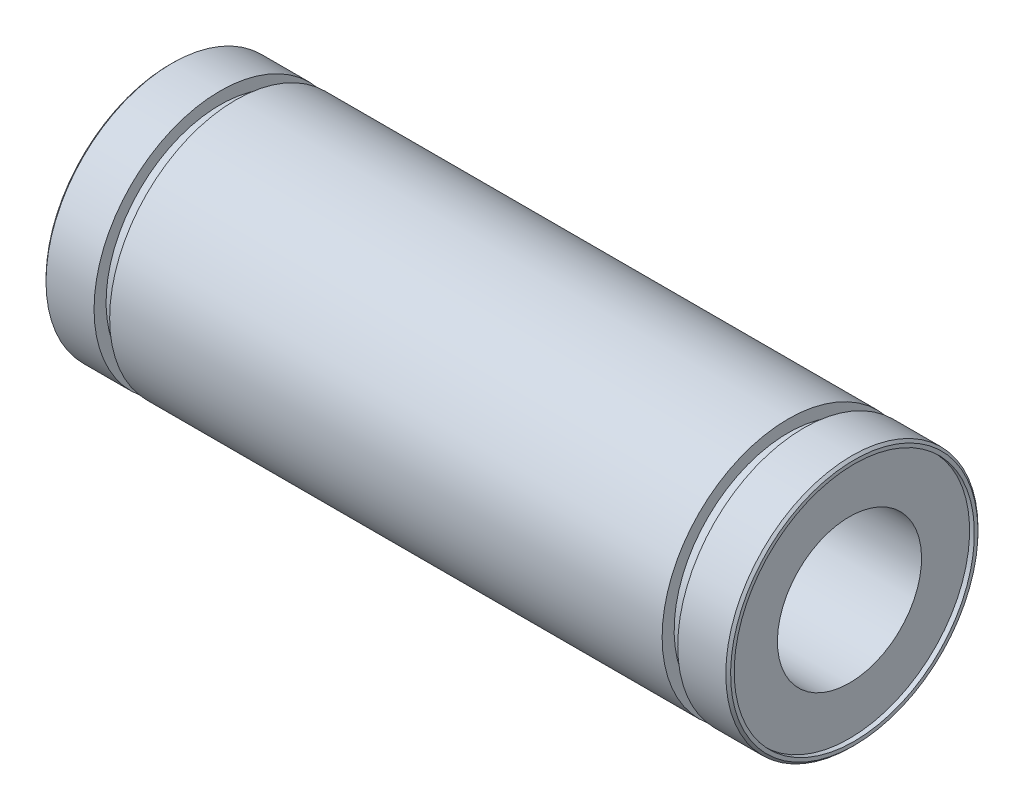
ISO-10303-21;
HEADER;
FILE_DESCRIPTION(('STEP AP214'),'2;1');
FILE_NAME('part.step','',(''),(''),'','','');
FILE_SCHEMA(('AUTOMOTIVE_DESIGN { 1 0 10303 214 1 1 1 1 }'));
ENDSEC;
DATA;
#1=APPLICATION_CONTEXT('core data for automotive mechanical design processes');
#2=APPLICATION_PROTOCOL_DEFINITION('international standard','automotive_design',2000,#1);
#3=PRODUCT_CONTEXT('',#1,'mechanical');
#4=PRODUCT('Part','Part','',(#3));
#5=PRODUCT_RELATED_PRODUCT_CATEGORY('part','',(#4));
#6=PRODUCT_DEFINITION_FORMATION('','',#4);
#7=PRODUCT_DEFINITION_CONTEXT('part definition',#1,'design');
#8=PRODUCT_DEFINITION('design','',#6,#7);
#9=PRODUCT_DEFINITION_SHAPE('','',#8);
#10=(LENGTH_UNIT() NAMED_UNIT(*) SI_UNIT(.MILLI.,.METRE.));
#11=(NAMED_UNIT(*) PLANE_ANGLE_UNIT() SI_UNIT($,.RADIAN.));
#12=(NAMED_UNIT(*) SI_UNIT($,.STERADIAN.) SOLID_ANGLE_UNIT());
#13=UNCERTAINTY_MEASURE_WITH_UNIT(LENGTH_MEASURE(1.E-05),#10,'distance_accuracy_value','');
#14=(GEOMETRIC_REPRESENTATION_CONTEXT(3) GLOBAL_UNCERTAINTY_ASSIGNED_CONTEXT((#13)) GLOBAL_UNIT_ASSIGNED_CONTEXT((#10,
#11,#12)) REPRESENTATION_CONTEXT('',''));
#15=CARTESIAN_POINT('',(0.,0.,0.));
#16=DIRECTION('',(0.,0.,1.));
#17=DIRECTION('',(1.,0.,0.));
#18=AXIS2_PLACEMENT_3D('',#15,#16,#17);
#19=CARTESIAN_POINT('',(-28.5,0.,0.));
#20=DIRECTION('',(-1.,0.,0.));
#21=DIRECTION('',(0.,-1.,0.));
#22=AXIS2_PLACEMENT_3D('',#19,#20,#21);
#23=PLANE('',#22);
#24=CARTESIAN_POINT('',(-28.5,0.,0.));
#25=DIRECTION('',(-1.,0.,0.));
#26=DIRECTION('',(0.,-1.,0.));
#27=AXIS2_PLACEMENT_3D('',#24,#25,#26);
#28=CIRCLE('',#27,10.3);
#29=CARTESIAN_POINT('',(-28.5,-10.3,0.));
#30=VERTEX_POINT('',#29);
#31=EDGE_CURVE('E102',#30,#30,#28,.T.);
#32=ORIENTED_EDGE('',*,*,#31,.T.);
#33=EDGE_LOOP('',(#32));
#34=FACE_BOUND('',#33,.T.);
#35=CARTESIAN_POINT('',(-28.5,0.,0.));
#36=DIRECTION('',(-1.,0.,0.));
#37=DIRECTION('',(0.,-1.,0.));
#38=AXIS2_PLACEMENT_3D('',#35,#36,#37);
#39=CIRCLE('',#38,10.);
#40=CARTESIAN_POINT('',(-28.5,-10.,0.));
#41=VERTEX_POINT('',#40);
#42=EDGE_CURVE('E12',#41,#41,#39,.T.);
#43=ORIENTED_EDGE('',*,*,#42,.F.);
#44=EDGE_LOOP('',(#43));
#45=FACE_BOUND('',#44,.T.);
#46=ADVANCED_FACE('F44',(#34,#45),#23,.T.);
#47=CARTESIAN_POINT('',(-28.5,0.,0.));
#48=DIRECTION('',(-1.,0.,0.));
#49=DIRECTION('',(0.,-1.,0.));
#50=AXIS2_PLACEMENT_3D('',#47,#48,#49);
#51=CYLINDRICAL_SURFACE('',#50,10.);
#52=ORIENTED_EDGE('',*,*,#42,.T.);
#53=EDGE_LOOP('',(#52));
#54=FACE_BOUND('',#53,.T.);
#55=CARTESIAN_POINT('',(-28.1,0.,0.));
#56=DIRECTION('',(-1.,0.,0.));
#57=DIRECTION('',(0.,-1.,0.));
#58=AXIS2_PLACEMENT_3D('',#55,#56,#57);
#59=CIRCLE('',#58,10.);
#60=CARTESIAN_POINT('',(-28.1,-10.,0.));
#61=VERTEX_POINT('',#60);
#62=EDGE_CURVE('E50',#61,#61,#59,.T.);
#63=ORIENTED_EDGE('',*,*,#62,.F.);
#64=EDGE_LOOP('',(#63));
#65=FACE_BOUND('',#64,.T.);
#66=ADVANCED_FACE('F120',(#54,#65),#51,.F.);
#67=CARTESIAN_POINT('',(-28.1,0.,0.));
#68=DIRECTION('',(-1.,0.,0.));
#69=DIRECTION('',(0.,-1.,0.));
#70=AXIS2_PLACEMENT_3D('',#67,#68,#69);
#71=PLANE('',#70);
#72=ORIENTED_EDGE('',*,*,#62,.T.);
#73=EDGE_LOOP('',(#72));
#74=FACE_BOUND('',#73,.T.);
#75=CARTESIAN_POINT('',(-28.1,0.,0.));
#76=DIRECTION('',(-1.,0.,0.));
#77=DIRECTION('',(0.,-1.,0.));
#78=AXIS2_PLACEMENT_3D('',#75,#76,#77);
#79=CIRCLE('',#78,6.);
#80=CARTESIAN_POINT('',(-28.1,-6.00000000000001,0.));
#81=VERTEX_POINT('',#80);
#82=EDGE_CURVE('E54',#81,#81,#79,.T.);
#83=ORIENTED_EDGE('',*,*,#82,.F.);
#84=EDGE_LOOP('',(#83));
#85=FACE_BOUND('',#84,.T.);
#86=ADVANCED_FACE('F124',(#74,#85),#71,.T.);
#87=CARTESIAN_POINT('',(-28.5,0.,0.));
#88=DIRECTION('',(-1.,0.,0.));
#89=DIRECTION('',(0.,-1.,0.));
#90=AXIS2_PLACEMENT_3D('',#87,#88,#89);
#91=CYLINDRICAL_SURFACE('',#90,6.);
#92=CARTESIAN_POINT('',(28.1,0.,0.));
#93=DIRECTION('',(-1.,0.,0.));
#94=DIRECTION('',(0.,-1.,0.));
#95=AXIS2_PLACEMENT_3D('',#92,#93,#94);
#96=CIRCLE('',#95,6.);
#97=CARTESIAN_POINT('',(28.1,-6.,0.));
#98=VERTEX_POINT('',#97);
#99=EDGE_CURVE('E58',#98,#98,#96,.T.);
#100=ORIENTED_EDGE('',*,*,#99,.F.);
#101=EDGE_LOOP('',(#100));
#102=FACE_BOUND('',#101,.T.);
#103=ORIENTED_EDGE('',*,*,#82,.T.);
#104=EDGE_LOOP('',(#103));
#105=FACE_BOUND('',#104,.T.);
#106=ADVANCED_FACE('F128',(#102,#105),#91,.F.);
#107=CARTESIAN_POINT('',(28.1,0.,0.));
#108=DIRECTION('',(-1.,0.,0.));
#109=DIRECTION('',(0.,-1.,0.));
#110=AXIS2_PLACEMENT_3D('',#107,#108,#109);
#111=PLANE('',#110);
#112=CARTESIAN_POINT('',(28.1,0.,0.));
#113=DIRECTION('',(-1.,0.,0.));
#114=DIRECTION('',(0.,-1.,0.));
#115=AXIS2_PLACEMENT_3D('',#112,#113,#114);
#116=CIRCLE('',#115,10.);
#117=CARTESIAN_POINT('',(28.1,-10.,0.));
#118=VERTEX_POINT('',#117);
#119=EDGE_CURVE('E63',#118,#118,#116,.T.);
#120=ORIENTED_EDGE('',*,*,#119,.F.);
#121=EDGE_LOOP('',(#120));
#122=FACE_BOUND('',#121,.T.);
#123=ORIENTED_EDGE('',*,*,#99,.T.);
#124=EDGE_LOOP('',(#123));
#125=FACE_BOUND('',#124,.T.);
#126=ADVANCED_FACE('F134',(#122,#125),#111,.F.);
#127=CARTESIAN_POINT('',(-28.5,0.,0.));
#128=DIRECTION('',(-1.,0.,0.));
#129=DIRECTION('',(0.,-1.,0.));
#130=AXIS2_PLACEMENT_3D('',#127,#128,#129);
#131=CYLINDRICAL_SURFACE('',#130,10.);
#132=CARTESIAN_POINT('',(28.5,0.,0.));
#133=DIRECTION('',(-1.,0.,0.));
#134=DIRECTION('',(0.,-1.,0.));
#135=AXIS2_PLACEMENT_3D('',#132,#133,#134);
#136=CIRCLE('',#135,10.);
#137=CARTESIAN_POINT('',(28.5,-10.,0.));
#138=VERTEX_POINT('',#137);
#139=EDGE_CURVE('E66',#138,#138,#136,.T.);
#140=ORIENTED_EDGE('',*,*,#139,.F.);
#141=EDGE_LOOP('',(#140));
#142=FACE_BOUND('',#141,.T.);
#143=ORIENTED_EDGE('',*,*,#119,.T.);
#144=EDGE_LOOP('',(#143));
#145=FACE_BOUND('',#144,.T.);
#146=ADVANCED_FACE('F138',(#142,#145),#131,.F.);
#147=CARTESIAN_POINT('',(28.5,0.,0.));
#148=DIRECTION('',(-1.,0.,0.));
#149=DIRECTION('',(0.,-1.,0.));
#150=AXIS2_PLACEMENT_3D('',#147,#148,#149);
#151=PLANE('',#150);
#152=CARTESIAN_POINT('',(28.5,0.,0.));
#153=DIRECTION('',(-1.,0.,0.));
#154=DIRECTION('',(0.,-1.,0.));
#155=AXIS2_PLACEMENT_3D('',#152,#153,#154);
#156=CIRCLE('',#155,10.3);
#157=CARTESIAN_POINT('',(28.5,-10.3,0.));
#158=VERTEX_POINT('',#157);
#159=EDGE_CURVE('E69',#158,#158,#156,.T.);
#160=ORIENTED_EDGE('',*,*,#159,.F.);
#161=EDGE_LOOP('',(#160));
#162=FACE_BOUND('',#161,.T.);
#163=ORIENTED_EDGE('',*,*,#139,.T.);
#164=EDGE_LOOP('',(#163));
#165=FACE_BOUND('',#164,.T.);
#166=ADVANCED_FACE('F142',(#162,#165),#151,.F.);
#167=CARTESIAN_POINT('',(28.5,0.,0.));
#168=DIRECTION('',(-1.,0.,0.));
#169=DIRECTION('',(0.,-1.,0.));
#170=AXIS2_PLACEMENT_3D('',#167,#168,#169);
#171=CONICAL_SURFACE('',#170,10.3,0.785398163397457);
#172=CARTESIAN_POINT('',(28.3,0.,0.));
#173=DIRECTION('',(-1.,0.,0.));
#174=DIRECTION('',(0.,-1.,0.));
#175=AXIS2_PLACEMENT_3D('',#172,#173,#174);
#176=CIRCLE('',#175,10.5);
#177=CARTESIAN_POINT('',(28.3,-10.5,0.));
#178=VERTEX_POINT('',#177);
#179=EDGE_CURVE('E72',#178,#178,#176,.T.);
#180=ORIENTED_EDGE('',*,*,#179,.F.);
#181=EDGE_LOOP('',(#180));
#182=FACE_BOUND('',#181,.T.);
#183=ORIENTED_EDGE('',*,*,#159,.T.);
#184=EDGE_LOOP('',(#183));
#185=FACE_BOUND('',#184,.T.);
#186=ADVANCED_FACE('F146',(#182,#185),#171,.T.);
#187=CARTESIAN_POINT('',(-28.5,0.,0.));
#188=DIRECTION('',(-1.,0.,0.));
#189=DIRECTION('',(0.,-1.,0.));
#190=AXIS2_PLACEMENT_3D('',#187,#188,#189);
#191=CYLINDRICAL_SURFACE('',#190,10.5);
#192=CARTESIAN_POINT('',(24.3,0.,0.));
#193=DIRECTION('',(-1.,0.,0.));
#194=DIRECTION('',(0.,-1.,0.));
#195=AXIS2_PLACEMENT_3D('',#192,#193,#194);
#196=CIRCLE('',#195,10.4999999999999);
#197=CARTESIAN_POINT('',(24.3,-10.4999999999999,0.));
#198=VERTEX_POINT('',#197);
#199=EDGE_CURVE('E75',#198,#198,#196,.T.);
#200=ORIENTED_EDGE('',*,*,#199,.F.);
#201=EDGE_LOOP('',(#200));
#202=FACE_BOUND('',#201,.T.);
#203=ORIENTED_EDGE('',*,*,#179,.T.);
#204=EDGE_LOOP('',(#203));
#205=FACE_BOUND('',#204,.T.);
#206=ADVANCED_FACE('F150',(#202,#205),#191,.T.);
#207=CARTESIAN_POINT('',(24.3,0.,0.));
#208=DIRECTION('',(1.,0.,0.));
#209=DIRECTION('',(0.,1.,0.));
#210=AXIS2_PLACEMENT_3D('',#207,#208,#209);
#211=PLANE('',#210);
#212=CARTESIAN_POINT('',(24.3,0.,0.));
#213=DIRECTION('',(-1.,0.,0.));
#214=DIRECTION('',(0.,-1.,0.));
#215=AXIS2_PLACEMENT_3D('',#212,#213,#214);
#216=CIRCLE('',#215,9.50000000000001);
#217=CARTESIAN_POINT('',(24.3,-9.50000000000001,0.));
#218=VERTEX_POINT('',#217);
#219=EDGE_CURVE('E78',#218,#218,#216,.T.);
#220=ORIENTED_EDGE('',*,*,#219,.F.);
#221=EDGE_LOOP('',(#220));
#222=FACE_BOUND('',#221,.T.);
#223=ORIENTED_EDGE('',*,*,#199,.T.);
#224=EDGE_LOOP('',(#223));
#225=FACE_BOUND('',#224,.T.);
#226=ADVANCED_FACE('F154',(#222,#225),#211,.F.);
#227=CARTESIAN_POINT('',(-28.5,0.,0.));
#228=DIRECTION('',(-1.,0.,0.));
#229=DIRECTION('',(0.,-1.,0.));
#230=AXIS2_PLACEMENT_3D('',#227,#228,#229);
#231=CYLINDRICAL_SURFACE('',#230,9.50000000000001);
#232=CARTESIAN_POINT('',(23.,0.,0.));
#233=DIRECTION('',(-1.,0.,0.));
#234=DIRECTION('',(0.,-1.,0.));
#235=AXIS2_PLACEMENT_3D('',#232,#233,#234);
#236=CIRCLE('',#235,9.50000000000001);
#237=CARTESIAN_POINT('',(23.,-9.50000000000001,0.));
#238=VERTEX_POINT('',#237);
#239=EDGE_CURVE('E81',#238,#238,#236,.T.);
#240=ORIENTED_EDGE('',*,*,#239,.F.);
#241=EDGE_LOOP('',(#240));
#242=FACE_BOUND('',#241,.T.);
#243=ORIENTED_EDGE('',*,*,#219,.T.);
#244=EDGE_LOOP('',(#243));
#245=FACE_BOUND('',#244,.T.);
#246=ADVANCED_FACE('F158',(#242,#245),#231,.T.);
#247=CARTESIAN_POINT('',(23.,0.,0.));
#248=DIRECTION('',(-1.,0.,0.));
#249=DIRECTION('',(0.,-1.,0.));
#250=AXIS2_PLACEMENT_3D('',#247,#248,#249);
#251=PLANE('',#250);
#252=CARTESIAN_POINT('',(23.,0.,0.));
#253=DIRECTION('',(-1.,0.,0.));
#254=DIRECTION('',(0.,-1.,0.));
#255=AXIS2_PLACEMENT_3D('',#252,#253,#254);
#256=CIRCLE('',#255,10.4999999999999);
#257=CARTESIAN_POINT('',(23.,-10.4999999999999,0.));
#258=VERTEX_POINT('',#257);
#259=EDGE_CURVE('E84',#258,#258,#256,.T.);
#260=ORIENTED_EDGE('',*,*,#259,.F.);
#261=EDGE_LOOP('',(#260));
#262=FACE_BOUND('',#261,.T.);
#263=ORIENTED_EDGE('',*,*,#239,.T.);
#264=EDGE_LOOP('',(#263));
#265=FACE_BOUND('',#264,.T.);
#266=ADVANCED_FACE('F162',(#262,#265),#251,.F.);
#267=CARTESIAN_POINT('',(-28.5,0.,0.));
#268=DIRECTION('',(-1.,0.,0.));
#269=DIRECTION('',(0.,-1.,0.));
#270=AXIS2_PLACEMENT_3D('',#267,#268,#269);
#271=CYLINDRICAL_SURFACE('',#270,10.4999999999999);
#272=CARTESIAN_POINT('',(-23.,0.,0.));
#273=DIRECTION('',(-1.,0.,0.));
#274=DIRECTION('',(0.,-1.,0.));
#275=AXIS2_PLACEMENT_3D('',#272,#273,#274);
#276=CIRCLE('',#275,10.4999999999999);
#277=CARTESIAN_POINT('',(-23.,-10.5,0.));
#278=VERTEX_POINT('',#277);
#279=EDGE_CURVE('E87',#278,#278,#276,.T.);
#280=ORIENTED_EDGE('',*,*,#279,.F.);
#281=EDGE_LOOP('',(#280));
#282=FACE_BOUND('',#281,.T.);
#283=ORIENTED_EDGE('',*,*,#259,.T.);
#284=EDGE_LOOP('',(#283));
#285=FACE_BOUND('',#284,.T.);
#286=ADVANCED_FACE('F166',(#282,#285),#271,.T.);
#287=CARTESIAN_POINT('',(-23.,0.,0.));
#288=DIRECTION('',(-1.,0.,0.));
#289=DIRECTION('',(0.,-1.,0.));
#290=AXIS2_PLACEMENT_3D('',#287,#288,#289);
#291=PLANE('',#290);
#292=ORIENTED_EDGE('',*,*,#279,.T.);
#293=EDGE_LOOP('',(#292));
#294=FACE_BOUND('',#293,.T.);
#295=CARTESIAN_POINT('',(-23.,0.,0.));
#296=DIRECTION('',(-1.,0.,0.));
#297=DIRECTION('',(0.,-1.,0.));
#298=AXIS2_PLACEMENT_3D('',#295,#296,#297);
#299=CIRCLE('',#298,9.50000000000001);
#300=CARTESIAN_POINT('',(-23.,-9.50000000000001,0.));
#301=VERTEX_POINT('',#300);
#302=EDGE_CURVE('E90',#301,#301,#299,.T.);
#303=ORIENTED_EDGE('',*,*,#302,.F.);
#304=EDGE_LOOP('',(#303));
#305=FACE_BOUND('',#304,.T.);
#306=ADVANCED_FACE('F170',(#294,#305),#291,.T.);
#307=CARTESIAN_POINT('',(-28.5,0.,0.));
#308=DIRECTION('',(-1.,0.,0.));
#309=DIRECTION('',(0.,-1.,0.));
#310=AXIS2_PLACEMENT_3D('',#307,#308,#309);
#311=CYLINDRICAL_SURFACE('',#310,9.50000000000001);
#312=ORIENTED_EDGE('',*,*,#302,.T.);
#313=EDGE_LOOP('',(#312));
#314=FACE_BOUND('',#313,.T.);
#315=CARTESIAN_POINT('',(-24.3,0.,0.));
#316=DIRECTION('',(-1.,0.,0.));
#317=DIRECTION('',(0.,-1.,0.));
#318=AXIS2_PLACEMENT_3D('',#315,#316,#317);
#319=CIRCLE('',#318,9.50000000000001);
#320=CARTESIAN_POINT('',(-24.3,-9.50000000000001,0.));
#321=VERTEX_POINT('',#320);
#322=EDGE_CURVE('E93',#321,#321,#319,.T.);
#323=ORIENTED_EDGE('',*,*,#322,.F.);
#324=EDGE_LOOP('',(#323));
#325=FACE_BOUND('',#324,.T.);
#326=ADVANCED_FACE('F174',(#314,#325),#311,.T.);
#327=CARTESIAN_POINT('',(-24.3,0.,0.));
#328=DIRECTION('',(1.,0.,0.));
#329=DIRECTION('',(0.,1.,0.));
#330=AXIS2_PLACEMENT_3D('',#327,#328,#329);
#331=PLANE('',#330);
#332=ORIENTED_EDGE('',*,*,#322,.T.);
#333=EDGE_LOOP('',(#332));
#334=FACE_BOUND('',#333,.T.);
#335=CARTESIAN_POINT('',(-24.3,0.,0.));
#336=DIRECTION('',(-1.,0.,0.));
#337=DIRECTION('',(0.,-1.,0.));
#338=AXIS2_PLACEMENT_3D('',#335,#336,#337);
#339=CIRCLE('',#338,10.4999999999999);
#340=CARTESIAN_POINT('',(-24.3,-10.5,0.));
#341=VERTEX_POINT('',#340);
#342=EDGE_CURVE('E96',#341,#341,#339,.T.);
#343=ORIENTED_EDGE('',*,*,#342,.F.);
#344=EDGE_LOOP('',(#343));
#345=FACE_BOUND('',#344,.T.);
#346=ADVANCED_FACE('F116',(#334,#345),#331,.T.);
#347=CARTESIAN_POINT('',(-28.5,0.,0.));
#348=DIRECTION('',(-1.,0.,0.));
#349=DIRECTION('',(0.,-1.,0.));
#350=AXIS2_PLACEMENT_3D('',#347,#348,#349);
#351=CYLINDRICAL_SURFACE('',#350,10.5);
#352=ORIENTED_EDGE('',*,*,#342,.T.);
#353=EDGE_LOOP('',(#352));
#354=FACE_BOUND('',#353,.T.);
#355=CARTESIAN_POINT('',(-28.3,0.,0.));
#356=DIRECTION('',(-1.,0.,0.));
#357=DIRECTION('',(0.,-1.,0.));
#358=AXIS2_PLACEMENT_3D('',#355,#356,#357);
#359=CIRCLE('',#358,10.5);
#360=CARTESIAN_POINT('',(-28.3,-10.5,0.));
#361=VERTEX_POINT('',#360);
#362=EDGE_CURVE('E99',#361,#361,#359,.T.);
#363=ORIENTED_EDGE('',*,*,#362,.F.);
#364=EDGE_LOOP('',(#363));
#365=FACE_BOUND('',#364,.T.);
#366=ADVANCED_FACE('F110',(#354,#365),#351,.T.);
#367=CARTESIAN_POINT('',(-28.5,0.,0.));
#368=DIRECTION('',(1.,0.,0.));
#369=DIRECTION('',(0.,1.,0.));
#370=AXIS2_PLACEMENT_3D('',#367,#368,#369);
#371=CONICAL_SURFACE('',#370,10.3,0.785398163397453);
#372=ORIENTED_EDGE('',*,*,#362,.T.);
#373=EDGE_LOOP('',(#372));
#374=FACE_BOUND('',#373,.T.);
#375=ORIENTED_EDGE('',*,*,#31,.F.);
#376=EDGE_LOOP('',(#375));
#377=FACE_BOUND('',#376,.T.);
#378=ADVANCED_FACE('F108',(#374,#377),#371,.T.);
#379=CLOSED_SHELL('',(#46,#66,#86,#106,#126,#146,#166,#186,#206,#226,#246,#266,#286,#306,#326,
#346,#366,#378));
#380=MANIFOLD_SOLID_BREP('B2',#379);
#381=ADVANCED_BREP_SHAPE_REPRESENTATION('',(#18,#380),#14);
#382=SHAPE_DEFINITION_REPRESENTATION(#9,#381);
ENDSEC;
END-ISO-10303-21;
